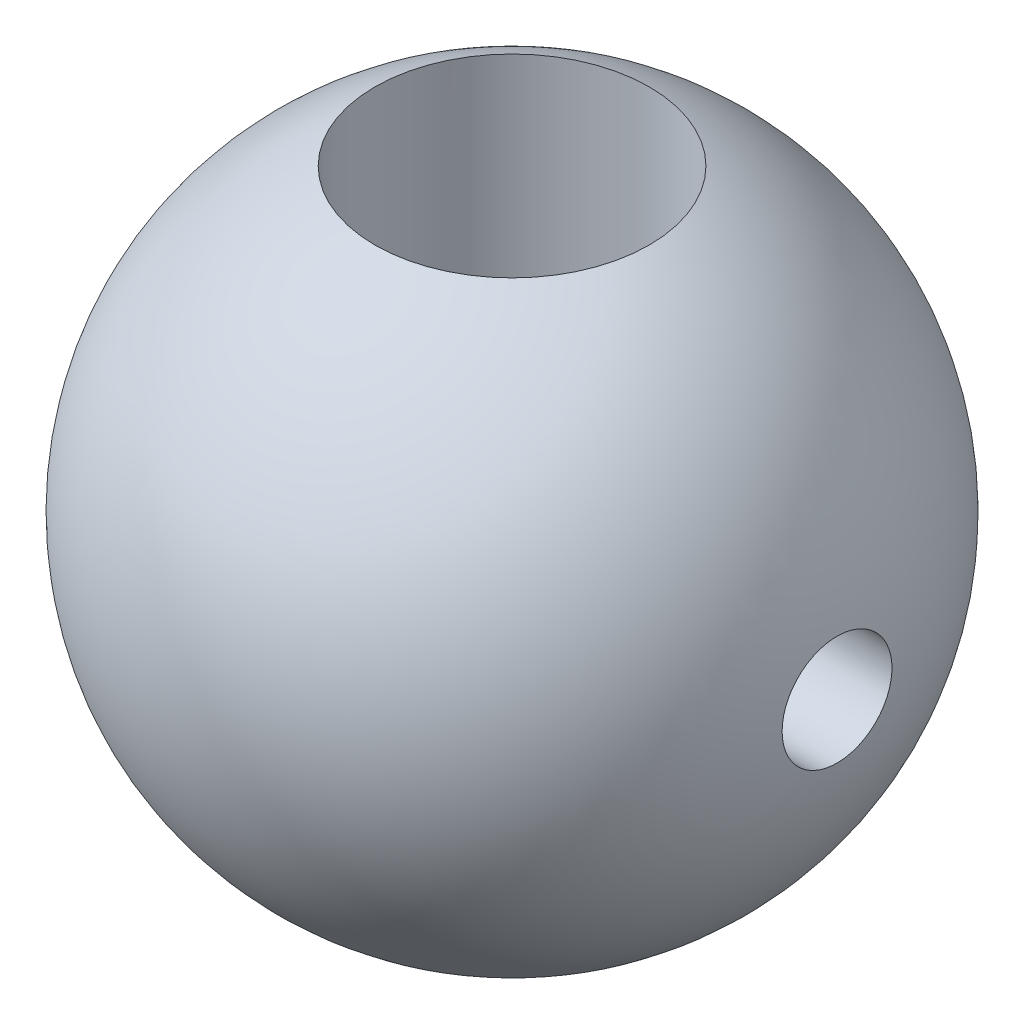
ISO-10303-21;
HEADER;
FILE_DESCRIPTION(('STEP AP214'),'2;1');
FILE_NAME('part.step','',(''),(''),'','','');
FILE_SCHEMA(('AUTOMOTIVE_DESIGN { 1 0 10303 214 1 1 1 1 }'));
ENDSEC;
DATA;
#1=APPLICATION_CONTEXT('core data for automotive mechanical design processes');
#2=APPLICATION_PROTOCOL_DEFINITION('international standard','automotive_design',2000,#1);
#3=PRODUCT_CONTEXT('',#1,'mechanical');
#4=PRODUCT('Part','Part','',(#3));
#5=PRODUCT_RELATED_PRODUCT_CATEGORY('part','',(#4));
#6=PRODUCT_DEFINITION_FORMATION('','',#4);
#7=PRODUCT_DEFINITION_CONTEXT('part definition',#1,'design');
#8=PRODUCT_DEFINITION('design','',#6,#7);
#9=PRODUCT_DEFINITION_SHAPE('','',#8);
#10=(LENGTH_UNIT() NAMED_UNIT(*) SI_UNIT(.MILLI.,.METRE.));
#11=(NAMED_UNIT(*) PLANE_ANGLE_UNIT() SI_UNIT($,.RADIAN.));
#12=(NAMED_UNIT(*) SI_UNIT($,.STERADIAN.) SOLID_ANGLE_UNIT());
#13=UNCERTAINTY_MEASURE_WITH_UNIT(LENGTH_MEASURE(1.E-05),#10,'distance_accuracy_value','');
#14=(GEOMETRIC_REPRESENTATION_CONTEXT(3) GLOBAL_UNCERTAINTY_ASSIGNED_CONTEXT((#13)) GLOBAL_UNIT_ASSIGNED_CONTEXT((#10,
#11,#12)) REPRESENTATION_CONTEXT('',''));
#15=CARTESIAN_POINT('',(0.,0.,0.));
#16=DIRECTION('',(0.,0.,1.));
#17=DIRECTION('',(1.,0.,0.));
#18=AXIS2_PLACEMENT_3D('',#15,#16,#17);
#19=CARTESIAN_POINT('',(0.,0.,0.));
#20=DIRECTION('',(0.,1.,0.));
#21=DIRECTION('',(1.,0.,0.));
#22=AXIS2_PLACEMENT_3D('',#19,#20,#21);
#23=SPHERICAL_SURFACE('',#22,9.525);
#24=CARTESIAN_POINT('',(0.,8.66169794208965,0.));
#25=DIRECTION('',(0.,1.,0.));
#26=DIRECTION('',(0.,0.,1.));
#27=AXIS2_PLACEMENT_3D('',#24,#25,#26);
#28=CIRCLE('',#27,3.9624);
#29=CARTESIAN_POINT('',(0.,8.66169794208965,3.9624));
#30=VERTEX_POINT('',#29);
#31=EDGE_CURVE('E10',#30,#30,#28,.T.);
#32=ORIENTED_EDGE('',*,*,#31,.F.);
#33=EDGE_LOOP('',(#32));
#34=FACE_BOUND('',#33,.T.);
#35=CARTESIAN_POINT('',(0.,-8.66169794208965,0.));
#36=DIRECTION('',(0.,1.,0.));
#37=DIRECTION('',(0.,0.,1.));
#38=AXIS2_PLACEMENT_3D('',#35,#36,#37);
#39=CIRCLE('',#38,3.9624);
#40=CARTESIAN_POINT('',(0.,-8.66169794208965,3.9624));
#41=VERTEX_POINT('',#40);
#42=EDGE_CURVE('E42',#41,#41,#39,.T.);
#43=ORIENTED_EDGE('',*,*,#42,.T.);
#44=EDGE_LOOP('',(#43));
#45=FACE_BOUND('',#44,.T.);
#46=CARTESIAN_POINT('',(9.39177665567064,0.,0.));
#47=DIRECTION('',(-1.,0.,0.));
#48=DIRECTION('',(0.,0.,1.));
#49=AXIS2_PLACEMENT_3D('',#46,#47,#48);
#50=CIRCLE('',#49,1.5875);
#51=CARTESIAN_POINT('',(9.39177665567064,0.,1.5875));
#52=VERTEX_POINT('',#51);
#53=EDGE_CURVE('E80',#52,#52,#50,.F.);
#54=ORIENTED_EDGE('',*,*,#53,.F.);
#55=EDGE_LOOP('',(#54));
#56=FACE_BOUND('',#55,.T.);
#57=CARTESIAN_POINT('',(-9.39177665567064,0.,0.));
#58=DIRECTION('',(1.,0.,0.));
#59=DIRECTION('',(0.,0.,-1.));
#60=AXIS2_PLACEMENT_3D('',#57,#58,#59);
#61=CIRCLE('',#60,1.5875);
#62=CARTESIAN_POINT('',(-9.39177665567064,0.,-1.5875));
#63=VERTEX_POINT('',#62);
#64=EDGE_CURVE('E47',#63,#63,#61,.F.);
#65=ORIENTED_EDGE('',*,*,#64,.F.);
#66=EDGE_LOOP('',(#65));
#67=FACE_BOUND('',#66,.T.);
#68=ADVANCED_FACE('F31',(#34,#45,#56,#67),#23,.T.);
#69=CARTESIAN_POINT('',(0.,11.238154958221,0.));
#70=DIRECTION('',(0.,1.,0.));
#71=DIRECTION('',(0.,0.,1.));
#72=AXIS2_PLACEMENT_3D('',#69,#70,#71);
#73=CYLINDRICAL_SURFACE('',#72,3.9624);
#74=ORIENTED_EDGE('',*,*,#42,.F.);
#75=EDGE_LOOP('',(#74));
#76=FACE_BOUND('',#75,.T.);
#77=ORIENTED_EDGE('',*,*,#31,.T.);
#78=EDGE_LOOP('',(#77));
#79=FACE_BOUND('',#78,.T.);
#80=CARTESIAN_POINT('',(-3.63048998208231,0.,1.5875));
#81=CARTESIAN_POINT('',(-3.63049860166507,-0.0850293845381576,1.58749065633051));
#82=CARTESIAN_POINT('',(-3.63351930596472,-0.170178320331612,1.5806280386829));
#83=CARTESIAN_POINT('',(-3.64522429294601,-0.338032825115651,1.55343427483823));
#84=CARTESIAN_POINT('',(-3.65392301870693,-0.420731599345273,1.53306877953105));
#85=CARTESIAN_POINT('',(-3.6758274235157,-0.580972730810104,1.47977266239197));
#86=CARTESIAN_POINT('',(-3.68901606873712,-0.658533272000699,1.44688947517429));
#87=CARTESIAN_POINT('',(-3.71839056207649,-0.807018822459914,1.36963001807659));
#88=CARTESIAN_POINT('',(-3.7345757626775,-0.877945260298232,1.3252562303428));
#89=CARTESIAN_POINT('',(-3.76915951379971,-1.01525966276955,1.22355108799482));
#90=CARTESIAN_POINT('',(-3.78762941074348,-1.0812194589445,1.16566565871303));
#91=CARTESIAN_POINT('',(-3.82411226056763,-1.20280795661352,1.03974672153168));
#92=CARTESIAN_POINT('',(-3.84212505160211,-1.25843304181041,0.97170967636241));
#93=CARTESIAN_POINT('',(-3.87652106762559,-1.35990071148356,0.82410908956461));
#94=CARTESIAN_POINT('',(-3.89281157889372,-1.40526897717645,0.744195920297107));
#95=CARTESIAN_POINT('',(-3.92106236727906,-1.48173569900398,0.577102307633451));
#96=CARTESIAN_POINT('',(-3.93302441136601,-1.51283997938152,0.489924847591711));
#97=CARTESIAN_POINT('',(-3.95076527021464,-1.55836674746694,0.315267314673553));
#98=CARTESIAN_POINT('',(-3.95681609122412,-1.57352583717539,0.228007430733212));
#99=CARTESIAN_POINT('',(-3.9630360750103,-1.58910412726288,0.0519866998195756));
#100=CARTESIAN_POINT('',(-3.96320743882592,-1.58952884361591,-0.0367735730163086));
#101=CARTESIAN_POINT('',(-3.95781451142904,-1.57602947504612,-0.207949906853732));
#102=CARTESIAN_POINT('',(-3.95257286194732,-1.56291255069481,-0.290441633410346));
#103=CARTESIAN_POINT('',(-3.93737807246517,-1.52407557798912,-0.451939194524751));
#104=CARTESIAN_POINT('',(-3.92742458667561,-1.49835460465225,-0.53094477277812));
#105=CARTESIAN_POINT('',(-3.90358943514598,-1.43472409804159,-0.684652184104046));
#106=CARTESIAN_POINT('',(-3.88965079236788,-1.39663659916509,-0.759271143743957));
#107=CARTESIAN_POINT('',(-3.85922785772182,-1.30952124764734,-0.901251277650391));
#108=CARTESIAN_POINT('',(-3.84274269277478,-1.2604896402264,-0.968609949217903));
#109=CARTESIAN_POINT('',(-3.80761790365709,-1.14911576141392,-1.09886592962499));
#110=CARTESIAN_POINT('',(-3.78890789152213,-1.08610966450852,-1.16117751121798));
#111=CARTESIAN_POINT('',(-3.75227824677165,-0.950470392145238,-1.27459067863638));
#112=CARTESIAN_POINT('',(-3.73435887609314,-0.87783405766775,-1.32568857135318));
#113=CARTESIAN_POINT('',(-3.70085976659175,-0.722369067178065,-1.41656981233452));
#114=CARTESIAN_POINT('',(-3.68536097780276,-0.639309441871138,-1.45599039620024));
#115=CARTESIAN_POINT('',(-3.6594077545824,-0.466944461356523,-1.52005182761746));
#116=CARTESIAN_POINT('',(-3.6489500322501,-0.377643220718839,-1.54470231112915));
#117=CARTESIAN_POINT('',(-3.63506177785545,-0.201173783136034,-1.5770965133273));
#118=CARTESIAN_POINT('',(-3.63124011374554,-0.114209878975291,-1.58578317134363));
#119=CARTESIAN_POINT('',(-3.62994222523247,0.0599980236615336,-1.58875397256679));
#120=CARTESIAN_POINT('',(-3.63246406689444,0.14724192867516,-1.58304250530684));
#121=CARTESIAN_POINT('',(-3.64316752573292,0.314284728998989,-1.55823779642886));
#122=CARTESIAN_POINT('',(-3.65101705710506,0.394223989997881,-1.53992890484142));
#123=CARTESIAN_POINT('',(-3.6710790409435,0.549842334533402,-1.49146743619686));
#124=CARTESIAN_POINT('',(-3.68329246269245,0.625520467285971,-1.46131222775466));
#125=CARTESIAN_POINT('',(-3.71131306850804,0.773897275694289,-1.38864671191942));
#126=CARTESIAN_POINT('',(-3.72724609634124,0.846349998075656,-1.34568423093519));
#127=CARTESIAN_POINT('',(-3.76071925377471,0.983348078567969,-1.24908549925998));
#128=CARTESIAN_POINT('',(-3.77826003792425,1.04789019089708,-1.19544489078507));
#129=CARTESIAN_POINT('',(-3.8145427293604,1.17220946762932,-1.0743173295744));
#130=CARTESIAN_POINT('',(-3.83327726112235,1.23127848857376,-1.00609861662742));
#131=CARTESIAN_POINT('',(-3.86861354480798,1.3372409189738,-0.860270332155506));
#132=CARTESIAN_POINT('',(-3.88521520750415,1.38413381913133,-0.782660368015928));
#133=CARTESIAN_POINT('',(-3.91446977344995,1.46424392285373,-0.619969034383934));
#134=CARTESIAN_POINT('',(-3.92712323745666,1.49746306869676,-0.534888728095198));
#135=CARTESIAN_POINT('',(-3.94702042089247,1.54889677584827,-0.359715491215378));
#136=CARTESIAN_POINT('',(-3.95426708654169,1.56711950941469,-0.269625319353446));
#137=CARTESIAN_POINT('',(-3.96221831360211,1.58707006649125,-0.0933465475917376));
#138=CARTESIAN_POINT('',(-3.96331986080946,1.5897990367533,-0.00728829442002258));
#139=CARTESIAN_POINT('',(-3.95993014534732,1.58133019740128,0.164018576016508));
#140=CARTESIAN_POINT('',(-3.95543973400656,1.57013450770008,0.249267314532395));
#141=CARTESIAN_POINT('',(-3.94156960694889,1.5348497199105,0.413834923342553));
#142=CARTESIAN_POINT('',(-3.9323452183939,1.5111696131634,0.493255625112019));
#143=CARTESIAN_POINT('',(-3.90999589418671,1.45201854905173,0.646981594384495));
#144=CARTESIAN_POINT('',(-3.89687024029796,1.41654542040808,0.721285916839035));
#145=CARTESIAN_POINT('',(-3.8672839799475,1.33304789550676,0.866282923379316));
#146=CARTESIAN_POINT('',(-3.85070153581703,1.28453770773726,0.936670455235368));
#147=CARTESIAN_POINT('',(-3.81619715197458,1.17706856586816,1.06860248328371));
#148=CARTESIAN_POINT('',(-3.79827465712802,1.118105267399,1.13014328339425));
#149=CARTESIAN_POINT('',(-3.76172535168452,0.987075026556042,1.2465916081757));
#150=CARTESIAN_POINT('',(-3.74312399092214,0.91442146377136,1.30084921065205));
#151=CARTESIAN_POINT('',(-3.70852195241108,0.760450834668667,1.39645088057639));
#152=CARTESIAN_POINT('',(-3.6925215772042,0.679132762329653,1.43779344628619));
#153=CARTESIAN_POINT('',(-3.66640976376903,0.517569363304279,1.50305593202854));
#154=CARTESIAN_POINT('',(-3.65589801573787,0.437885753602079,1.5282087119244));
#155=CARTESIAN_POINT('',(-3.64001365683373,0.27520425943001,1.56567684110845));
#156=CARTESIAN_POINT('',(-3.63462674435828,0.192216275526492,1.57802792408541));
#157=CARTESIAN_POINT('',(-3.6310318179464,0.0725937353082924,1.58625841384787));
#158=CARTESIAN_POINT('',(-3.63048630149823,0.0363077666162906,1.58750398977098));
#159=CARTESIAN_POINT('',(-3.63048998208231,0.,1.5875));
#160=B_SPLINE_CURVE_WITH_KNOTS('',3,(#80,#81,#82,#83,#84,#85,#86,#87,#88,#89,#90,#91,#92,#93,
#94,#95,#96,#97,#98,#99,#100,#101,#102,#103,#104,#105,#106,#107,#108,#109,#110,#111,#112,#113,
#114,#115,#116,#117,#118,#119,#120,#121,#122,#123,#124,#125,#126,#127,#128,#129,#130,#131,#132,
#133,#134,#135,#136,#137,#138,#139,#140,#141,#142,#143,#144,#145,#146,#147,#148,#149,#150,#151,
#152,#153,#154,#155,#156,#157,#158,#159),.UNSPECIFIED.,.T.,.F.,(4,2,2,2,2,2,2,2,2,2,2,2,2,2,2,2,
2,2,2,2,2,2,2,2,2,2,2,2,2,2,2,2,2,2,2,2,2,2,2,4),(0.,0.254975059857851,0.510601235908144,
0.765268230907545,1.01988025974785,1.2877402919308,1.55569387724707,1.83425280969733,
2.11269790000774,2.37762413584636,2.64245119257701,2.89235609221845,3.14227933455946,
3.39597166537711,3.64975116884934,3.92023946994151,4.19081672022148,4.46908250974916,
4.74716656145541,5.00822041169194,5.26919468448779,5.5152370353265,5.76133406970851,
6.01742918295331,6.27362902463017,6.54882529246467,6.82403306924858,7.09920174084939,
7.37422036047743,7.6312465026493,7.88823351953262,8.13728161881958,8.38637559716011,
8.64648818701371,8.90670913559177,9.18310200074598,9.45952699243324,9.71108213833467,
9.96193320560453,10.0708082141275),.UNSPECIFIED.);
#161=CARTESIAN_POINT('',(-3.63048998208231,0.,1.5875));
#162=VERTEX_POINT('',#161);
#163=EDGE_CURVE('E50',#162,#162,#160,.T.);
#164=ORIENTED_EDGE('',*,*,#163,.F.);
#165=EDGE_LOOP('',(#164));
#166=FACE_BOUND('',#165,.T.);
#167=CARTESIAN_POINT('',(3.63048998208231,0.,1.5875));
#168=CARTESIAN_POINT('',(3.63049860166507,0.0850293845381576,1.58749065633051));
#169=CARTESIAN_POINT('',(3.63351930596472,0.170178320331612,1.5806280386829));
#170=CARTESIAN_POINT('',(3.64522429294601,0.338032825115651,1.55343427483823));
#171=CARTESIAN_POINT('',(3.65392301870693,0.420731599345273,1.53306877953105));
#172=CARTESIAN_POINT('',(3.6758274235157,0.580972730810104,1.47977266239197));
#173=CARTESIAN_POINT('',(3.68901606873712,0.658533272000699,1.44688947517429));
#174=CARTESIAN_POINT('',(3.71839056207649,0.807018822459914,1.36963001807659));
#175=CARTESIAN_POINT('',(3.7345757626775,0.877945260298232,1.3252562303428));
#176=CARTESIAN_POINT('',(3.76915951379971,1.01525966276955,1.22355108799482));
#177=CARTESIAN_POINT('',(3.78762941074348,1.0812194589445,1.16566565871303));
#178=CARTESIAN_POINT('',(3.82411226056763,1.20280795661352,1.03974672153168));
#179=CARTESIAN_POINT('',(3.84212505160211,1.25843304181041,0.97170967636241));
#180=CARTESIAN_POINT('',(3.87652106762559,1.35990071148356,0.82410908956461));
#181=CARTESIAN_POINT('',(3.89281157889372,1.40526897717645,0.744195920297107));
#182=CARTESIAN_POINT('',(3.92106236727906,1.48173569900398,0.577102307633451));
#183=CARTESIAN_POINT('',(3.93302441136601,1.51283997938152,0.489924847591711));
#184=CARTESIAN_POINT('',(3.95076527021464,1.55836674746694,0.315267314673553));
#185=CARTESIAN_POINT('',(3.95681609122412,1.57352583717539,0.228007430733212));
#186=CARTESIAN_POINT('',(3.9630360750103,1.58910412726288,0.0519866998195756));
#187=CARTESIAN_POINT('',(3.96320743882592,1.58952884361591,-0.0367735730163086));
#188=CARTESIAN_POINT('',(3.95781451142904,1.57602947504612,-0.207949906853732));
#189=CARTESIAN_POINT('',(3.95257286194732,1.56291255069481,-0.290441633410346));
#190=CARTESIAN_POINT('',(3.93737807246517,1.52407557798912,-0.451939194524751));
#191=CARTESIAN_POINT('',(3.92742458667561,1.49835460465225,-0.53094477277812));
#192=CARTESIAN_POINT('',(3.90358943514598,1.43472409804159,-0.684652184104046));
#193=CARTESIAN_POINT('',(3.88965079236788,1.39663659916509,-0.759271143743957));
#194=CARTESIAN_POINT('',(3.85922785772182,1.30952124764734,-0.901251277650391));
#195=CARTESIAN_POINT('',(3.84274269277478,1.2604896402264,-0.968609949217903));
#196=CARTESIAN_POINT('',(3.80761790365709,1.14911576141392,-1.09886592962499));
#197=CARTESIAN_POINT('',(3.78890789152213,1.08610966450852,-1.16117751121798));
#198=CARTESIAN_POINT('',(3.75227824677165,0.950470392145238,-1.27459067863638));
#199=CARTESIAN_POINT('',(3.73435887609314,0.87783405766775,-1.32568857135318));
#200=CARTESIAN_POINT('',(3.70085976659175,0.722369067178065,-1.41656981233452));
#201=CARTESIAN_POINT('',(3.68536097780276,0.639309441871138,-1.45599039620024));
#202=CARTESIAN_POINT('',(3.6594077545824,0.466944461356523,-1.52005182761746));
#203=CARTESIAN_POINT('',(3.6489500322501,0.377643220718839,-1.54470231112915));
#204=CARTESIAN_POINT('',(3.63506177785545,0.201173783136034,-1.5770965133273));
#205=CARTESIAN_POINT('',(3.63124011374554,0.114209878975291,-1.58578317134363));
#206=CARTESIAN_POINT('',(3.62994222523247,-0.0599980236615336,-1.58875397256679));
#207=CARTESIAN_POINT('',(3.63246406689444,-0.14724192867516,-1.58304250530684));
#208=CARTESIAN_POINT('',(3.64316752573292,-0.314284728998989,-1.55823779642886));
#209=CARTESIAN_POINT('',(3.65101705710506,-0.394223989997881,-1.53992890484142));
#210=CARTESIAN_POINT('',(3.6710790409435,-0.549842334533402,-1.49146743619686));
#211=CARTESIAN_POINT('',(3.68329246269245,-0.625520467285971,-1.46131222775466));
#212=CARTESIAN_POINT('',(3.71131306850804,-0.773897275694289,-1.38864671191942));
#213=CARTESIAN_POINT('',(3.72724609634124,-0.846349998075656,-1.34568423093519));
#214=CARTESIAN_POINT('',(3.76071925377471,-0.983348078567969,-1.24908549925998));
#215=CARTESIAN_POINT('',(3.77826003792425,-1.04789019089708,-1.19544489078507));
#216=CARTESIAN_POINT('',(3.8145427293604,-1.17220946762932,-1.0743173295744));
#217=CARTESIAN_POINT('',(3.83327726112235,-1.23127848857376,-1.00609861662742));
#218=CARTESIAN_POINT('',(3.86861354480798,-1.3372409189738,-0.860270332155506));
#219=CARTESIAN_POINT('',(3.88521520750415,-1.38413381913133,-0.782660368015928));
#220=CARTESIAN_POINT('',(3.91446977344995,-1.46424392285373,-0.619969034383934));
#221=CARTESIAN_POINT('',(3.92712323745666,-1.49746306869676,-0.534888728095198));
#222=CARTESIAN_POINT('',(3.94702042089247,-1.54889677584827,-0.359715491215378));
#223=CARTESIAN_POINT('',(3.95426708654169,-1.56711950941469,-0.269625319353446));
#224=CARTESIAN_POINT('',(3.96221831360211,-1.58707006649125,-0.0933465475917376));
#225=CARTESIAN_POINT('',(3.96331986080946,-1.5897990367533,-0.00728829442002258));
#226=CARTESIAN_POINT('',(3.95993014534732,-1.58133019740128,0.164018576016508));
#227=CARTESIAN_POINT('',(3.95543973400656,-1.57013450770008,0.249267314532395));
#228=CARTESIAN_POINT('',(3.94156960694889,-1.5348497199105,0.413834923342553));
#229=CARTESIAN_POINT('',(3.9323452183939,-1.5111696131634,0.493255625112019));
#230=CARTESIAN_POINT('',(3.90999589418671,-1.45201854905173,0.646981594384495));
#231=CARTESIAN_POINT('',(3.89687024029796,-1.41654542040808,0.721285916839035));
#232=CARTESIAN_POINT('',(3.8672839799475,-1.33304789550676,0.866282923379316));
#233=CARTESIAN_POINT('',(3.85070153581703,-1.28453770773726,0.936670455235368));
#234=CARTESIAN_POINT('',(3.81619715197458,-1.17706856586816,1.06860248328371));
#235=CARTESIAN_POINT('',(3.79827465712802,-1.118105267399,1.13014328339425));
#236=CARTESIAN_POINT('',(3.76172535168452,-0.987075026556042,1.2465916081757));
#237=CARTESIAN_POINT('',(3.74312399092214,-0.91442146377136,1.30084921065205));
#238=CARTESIAN_POINT('',(3.70852195241108,-0.760450834668667,1.39645088057639));
#239=CARTESIAN_POINT('',(3.6925215772042,-0.679132762329653,1.43779344628619));
#240=CARTESIAN_POINT('',(3.66640976376903,-0.517569363304279,1.50305593202854));
#241=CARTESIAN_POINT('',(3.65589801573787,-0.437885753602079,1.5282087119244));
#242=CARTESIAN_POINT('',(3.64001365683373,-0.27520425943001,1.56567684110845));
#243=CARTESIAN_POINT('',(3.63462674435828,-0.192216275526492,1.57802792408541));
#244=CARTESIAN_POINT('',(3.6310318179464,-0.0725937353082924,1.58625841384787));
#245=CARTESIAN_POINT('',(3.63048630149823,-0.0363077666162906,1.58750398977098));
#246=CARTESIAN_POINT('',(3.63048998208231,0.,1.5875));
#247=B_SPLINE_CURVE_WITH_KNOTS('',3,(#167,#168,#169,#170,#171,#172,#173,#174,#175,#176,#177,
#178,#179,#180,#181,#182,#183,#184,#185,#186,#187,#188,#189,#190,#191,#192,#193,#194,#195,#196,
#197,#198,#199,#200,#201,#202,#203,#204,#205,#206,#207,#208,#209,#210,#211,#212,#213,#214,#215,
#216,#217,#218,#219,#220,#221,#222,#223,#224,#225,#226,#227,#228,#229,#230,#231,#232,#233,#234,
#235,#236,#237,#238,#239,#240,#241,#242,#243,#244,#245,#246),.UNSPECIFIED.,.T.,.F.,(4,2,2,2,2,2,
2,2,2,2,2,2,2,2,2,2,2,2,2,2,2,2,2,2,2,2,2,2,2,2,2,2,2,2,2,2,2,2,2,4),(0.,0.254975059857851,
0.510601235908144,0.765268230907545,1.01988025974785,1.2877402919308,1.55569387724707,
1.83425280969733,2.11269790000774,2.37762413584636,2.64245119257701,2.89235609221845,
3.14227933455946,3.39597166537711,3.64975116884934,3.92023946994151,4.19081672022148,
4.46908250974916,4.74716656145541,5.00822041169194,5.26919468448779,5.5152370353265,
5.76133406970851,6.01742918295331,6.27362902463017,6.54882529246467,6.82403306924858,
7.09920174084939,7.37422036047743,7.6312465026493,7.88823351953262,8.13728161881958,
8.38637559716011,8.64648818701371,8.90670913559177,9.18310200074598,9.45952699243324,
9.71108213833467,9.96193320560453,10.0708082141275),.UNSPECIFIED.);
#248=CARTESIAN_POINT('',(3.63048998208231,0.,1.5875));
#249=VERTEX_POINT('',#248);
#250=EDGE_CURVE('E34',#249,#249,#247,.T.);
#251=ORIENTED_EDGE('',*,*,#250,.F.);
#252=EDGE_LOOP('',(#251));
#253=FACE_BOUND('',#252,.T.);
#254=ADVANCED_FACE('F55',(#76,#79,#166,#253),#73,.F.);
#255=CARTESIAN_POINT('',(-12.1936452887659,0.,0.));
#256=DIRECTION('',(-1.,0.,0.));
#257=DIRECTION('',(0.,0.,1.));
#258=AXIS2_PLACEMENT_3D('',#255,#256,#257);
#259=CYLINDRICAL_SURFACE('',#258,1.5875);
#260=ORIENTED_EDGE('',*,*,#163,.T.);
#261=EDGE_LOOP('',(#260));
#262=FACE_BOUND('',#261,.T.);
#263=ORIENTED_EDGE('',*,*,#64,.T.);
#264=EDGE_LOOP('',(#263));
#265=FACE_BOUND('',#264,.T.);
#266=ADVANCED_FACE('F57',(#262,#265),#259,.F.);
#267=ORIENTED_EDGE('',*,*,#250,.T.);
#268=EDGE_LOOP('',(#267));
#269=FACE_BOUND('',#268,.T.);
#270=ORIENTED_EDGE('',*,*,#53,.T.);
#271=EDGE_LOOP('',(#270));
#272=FACE_BOUND('',#271,.T.);
#273=ADVANCED_FACE('F60',(#269,#272),#259,.F.);
#274=CLOSED_SHELL('',(#68,#254,#266,#273));
#275=MANIFOLD_SOLID_BREP('B2',#274);
#276=ADVANCED_BREP_SHAPE_REPRESENTATION('',(#18,#275),#14);
#277=SHAPE_DEFINITION_REPRESENTATION(#9,#276);
ENDSEC;
END-ISO-10303-21;
